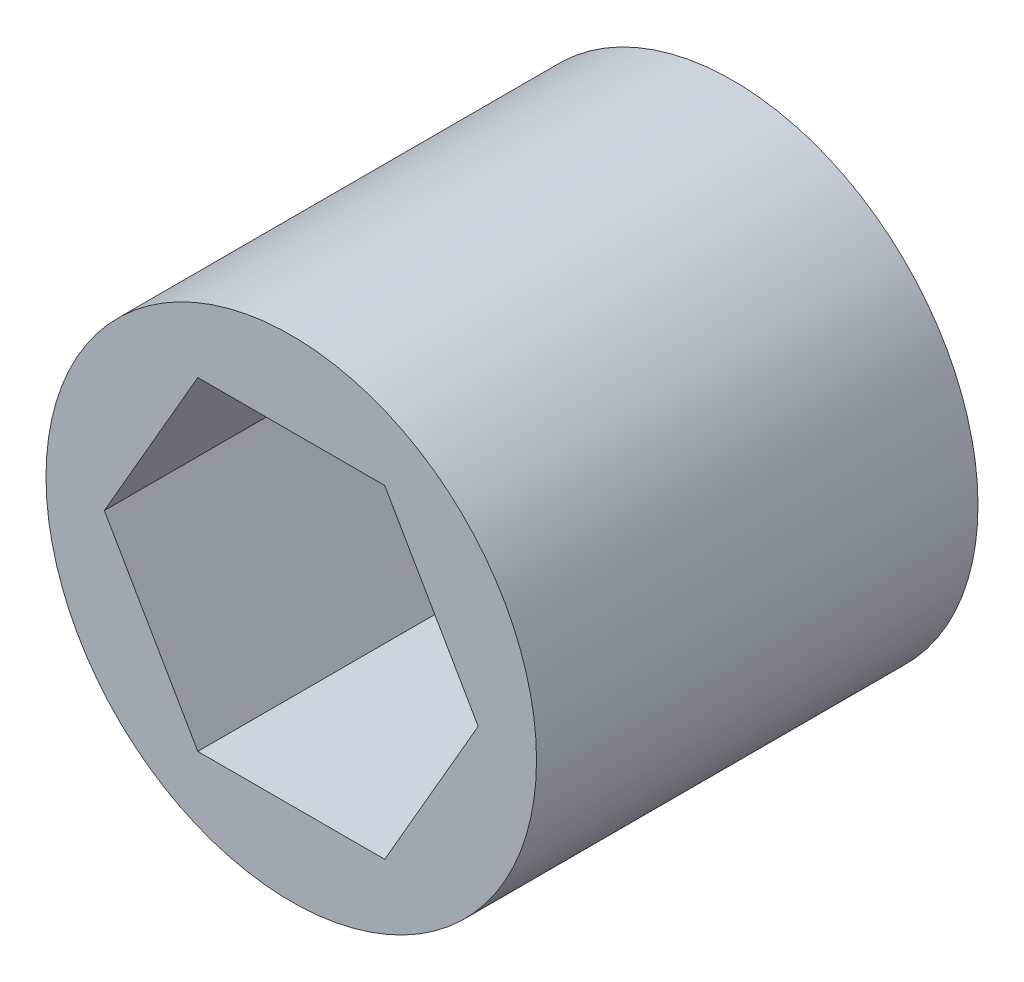
ISO-10303-21;
HEADER;
FILE_DESCRIPTION(('STEP AP214'),'2;1');
FILE_NAME('part.step','',(''),(''),'','','');
FILE_SCHEMA(('AUTOMOTIVE_DESIGN { 1 0 10303 214 1 1 1 1 }'));
ENDSEC;
DATA;
#1=APPLICATION_CONTEXT('core data for automotive mechanical design processes');
#2=APPLICATION_PROTOCOL_DEFINITION('international standard','automotive_design',2000,#1);
#3=PRODUCT_CONTEXT('',#1,'mechanical');
#4=PRODUCT('Part','Part','',(#3));
#5=PRODUCT_RELATED_PRODUCT_CATEGORY('part','',(#4));
#6=PRODUCT_DEFINITION_FORMATION('','',#4);
#7=PRODUCT_DEFINITION_CONTEXT('part definition',#1,'design');
#8=PRODUCT_DEFINITION('design','',#6,#7);
#9=PRODUCT_DEFINITION_SHAPE('','',#8);
#10=(LENGTH_UNIT() NAMED_UNIT(*) SI_UNIT(.MILLI.,.METRE.));
#11=(NAMED_UNIT(*) PLANE_ANGLE_UNIT() SI_UNIT($,.RADIAN.));
#12=(NAMED_UNIT(*) SI_UNIT($,.STERADIAN.) SOLID_ANGLE_UNIT());
#13=UNCERTAINTY_MEASURE_WITH_UNIT(LENGTH_MEASURE(1.E-05),#10,'distance_accuracy_value','');
#14=(GEOMETRIC_REPRESENTATION_CONTEXT(3) GLOBAL_UNCERTAINTY_ASSIGNED_CONTEXT((#13)) GLOBAL_UNIT_ASSIGNED_CONTEXT((#10,
#11,#12)) REPRESENTATION_CONTEXT('',''));
#15=CARTESIAN_POINT('',(0.,0.,0.));
#16=DIRECTION('',(0.,0.,1.));
#17=DIRECTION('',(1.,0.,0.));
#18=AXIS2_PLACEMENT_3D('',#15,#16,#17);
#19=CARTESIAN_POINT('',(0.,0.,18.));
#20=DIRECTION('',(0.,0.,1.));
#21=DIRECTION('',(1.,0.,0.));
#22=AXIS2_PLACEMENT_3D('',#19,#20,#21);
#23=PLANE('',#22);
#24=CARTESIAN_POINT('',(0.,0.,18.));
#25=DIRECTION('',(0.,0.,1.));
#26=DIRECTION('',(1.,0.,0.));
#27=AXIS2_PLACEMENT_3D('',#24,#25,#26);
#28=CIRCLE('',#27,10.);
#29=CARTESIAN_POINT('',(10.,0.,18.));
#30=VERTEX_POINT('',#29);
#31=EDGE_CURVE('E11',#30,#30,#28,.T.);
#32=ORIENTED_EDGE('',*,*,#31,.T.);
#33=EDGE_LOOP('',(#32));
#34=FACE_BOUND('',#33,.T.);
#35=DIRECTION('',(0.5,-0.866025403784439,0.));
#36=VECTOR('',#35,1.);
#37=CARTESIAN_POINT('',(-7.62102355330306,0.,18.));
#38=LINE('',#37,#36);
#39=CARTESIAN_POINT('',(-7.62102355330306,0.,18.));
#40=VERTEX_POINT('',#39);
#41=CARTESIAN_POINT('',(-3.81051177665153,-6.6,18.));
#42=VERTEX_POINT('',#41);
#43=EDGE_CURVE('E94',#40,#42,#38,.T.);
#44=ORIENTED_EDGE('',*,*,#43,.F.);
#45=DIRECTION('',(-0.5,-0.866025403784439,0.));
#46=VECTOR('',#45,1.);
#47=CARTESIAN_POINT('',(-3.81051177665153,6.6,18.));
#48=LINE('',#47,#46);
#49=CARTESIAN_POINT('',(-3.81051177665153,6.6,18.));
#50=VERTEX_POINT('',#49);
#51=EDGE_CURVE('E86',#50,#40,#48,.T.);
#52=ORIENTED_EDGE('',*,*,#51,.F.);
#53=DIRECTION('',(-1.,0.,0.));
#54=VECTOR('',#53,1.);
#55=CARTESIAN_POINT('',(3.81051177665153,6.6,18.));
#56=LINE('',#55,#54);
#57=CARTESIAN_POINT('',(3.81051177665153,6.6,18.));
#58=VERTEX_POINT('',#57);
#59=EDGE_CURVE('E114',#58,#50,#56,.T.);
#60=ORIENTED_EDGE('',*,*,#59,.F.);
#61=DIRECTION('',(-0.5,0.866025403784438,0.));
#62=VECTOR('',#61,1.);
#63=CARTESIAN_POINT('',(7.62102355330306,0.,18.));
#64=LINE('',#63,#62);
#65=CARTESIAN_POINT('',(7.62102355330306,0.,18.));
#66=VERTEX_POINT('',#65);
#67=EDGE_CURVE('E112',#66,#58,#64,.T.);
#68=ORIENTED_EDGE('',*,*,#67,.F.);
#69=DIRECTION('',(0.5,0.866025403784439,0.));
#70=VECTOR('',#69,1.);
#71=CARTESIAN_POINT('',(3.81051177665153,-6.6,18.));
#72=LINE('',#71,#70);
#73=CARTESIAN_POINT('',(3.81051177665153,-6.6,18.));
#74=VERTEX_POINT('',#73);
#75=EDGE_CURVE('E108',#74,#66,#72,.T.);
#76=ORIENTED_EDGE('',*,*,#75,.F.);
#77=DIRECTION('',(1.,0.,0.));
#78=VECTOR('',#77,1.);
#79=CARTESIAN_POINT('',(-3.81051177665153,-6.6,18.));
#80=LINE('',#79,#78);
#81=EDGE_CURVE('E106',#42,#74,#80,.T.);
#82=ORIENTED_EDGE('',*,*,#81,.F.);
#83=EDGE_LOOP('',(#44,#52,#60,#68,#76,#82));
#84=FACE_BOUND('',#83,.T.);
#85=ADVANCED_FACE('F33',(#34,#84),#23,.T.);
#86=CARTESIAN_POINT('',(0.,0.,0.));
#87=DIRECTION('',(0.,0.,1.));
#88=DIRECTION('',(1.,0.,0.));
#89=AXIS2_PLACEMENT_3D('',#86,#87,#88);
#90=PLANE('',#89);
#91=CARTESIAN_POINT('',(0.,0.,0.));
#92=DIRECTION('',(0.,0.,1.));
#93=DIRECTION('',(1.,0.,0.));
#94=AXIS2_PLACEMENT_3D('',#91,#92,#93);
#95=CIRCLE('',#94,10.);
#96=CARTESIAN_POINT('',(10.,0.,0.));
#97=VERTEX_POINT('',#96);
#98=EDGE_CURVE('E37',#97,#97,#95,.T.);
#99=ORIENTED_EDGE('',*,*,#98,.F.);
#100=EDGE_LOOP('',(#99));
#101=FACE_BOUND('',#100,.T.);
#102=DIRECTION('',(-0.5,-0.866025403784439,0.));
#103=VECTOR('',#102,1.);
#104=CARTESIAN_POINT('',(-3.81051177665153,6.6,0.));
#105=LINE('',#104,#103);
#106=CARTESIAN_POINT('',(-3.81051177665153,6.6,0.));
#107=VERTEX_POINT('',#106);
#108=CARTESIAN_POINT('',(-7.62102355330306,0.,0.));
#109=VERTEX_POINT('',#108);
#110=EDGE_CURVE('E56',#107,#109,#105,.T.);
#111=ORIENTED_EDGE('',*,*,#110,.T.);
#112=DIRECTION('',(0.5,-0.866025403784439,0.));
#113=VECTOR('',#112,1.);
#114=CARTESIAN_POINT('',(-7.62102355330306,0.,0.));
#115=LINE('',#114,#113);
#116=CARTESIAN_POINT('',(-3.81051177665153,-6.6,0.));
#117=VERTEX_POINT('',#116);
#118=EDGE_CURVE('E101',#109,#117,#115,.T.);
#119=ORIENTED_EDGE('',*,*,#118,.T.);
#120=DIRECTION('',(1.,0.,0.));
#121=VECTOR('',#120,1.);
#122=CARTESIAN_POINT('',(-3.81051177665153,-6.6,0.));
#123=LINE('',#122,#121);
#124=CARTESIAN_POINT('',(3.81051177665153,-6.6,0.));
#125=VERTEX_POINT('',#124);
#126=EDGE_CURVE('E118',#117,#125,#123,.T.);
#127=ORIENTED_EDGE('',*,*,#126,.T.);
#128=DIRECTION('',(0.5,0.866025403784439,0.));
#129=VECTOR('',#128,1.);
#130=CARTESIAN_POINT('',(3.81051177665153,-6.6,0.));
#131=LINE('',#130,#129);
#132=CARTESIAN_POINT('',(7.62102355330306,0.,0.));
#133=VERTEX_POINT('',#132);
#134=EDGE_CURVE('E121',#125,#133,#131,.T.);
#135=ORIENTED_EDGE('',*,*,#134,.T.);
#136=DIRECTION('',(-0.5,0.866025403784438,0.));
#137=VECTOR('',#136,1.);
#138=CARTESIAN_POINT('',(7.62102355330306,0.,0.));
#139=LINE('',#138,#137);
#140=CARTESIAN_POINT('',(3.81051177665153,6.6,0.));
#141=VERTEX_POINT('',#140);
#142=EDGE_CURVE('E124',#133,#141,#139,.T.);
#143=ORIENTED_EDGE('',*,*,#142,.T.);
#144=DIRECTION('',(-1.,0.,0.));
#145=VECTOR('',#144,1.);
#146=CARTESIAN_POINT('',(3.81051177665153,6.6,0.));
#147=LINE('',#146,#145);
#148=EDGE_CURVE('E95',#141,#107,#147,.T.);
#149=ORIENTED_EDGE('',*,*,#148,.T.);
#150=EDGE_LOOP('',(#111,#119,#127,#135,#143,#149));
#151=FACE_BOUND('',#150,.T.);
#152=ADVANCED_FACE('F141',(#101,#151),#90,.F.);
#153=CARTESIAN_POINT('',(0.,0.,18.));
#154=DIRECTION('',(0.,0.,-1.));
#155=DIRECTION('',(-1.,0.,0.));
#156=AXIS2_PLACEMENT_3D('',#153,#154,#155);
#157=CYLINDRICAL_SURFACE('',#156,10.);
#158=ORIENTED_EDGE('',*,*,#31,.F.);
#159=EDGE_LOOP('',(#158));
#160=FACE_BOUND('',#159,.T.);
#161=ORIENTED_EDGE('',*,*,#98,.T.);
#162=EDGE_LOOP('',(#161));
#163=FACE_BOUND('',#162,.T.);
#164=ADVANCED_FACE('F35',(#160,#163),#157,.T.);
#165=CARTESIAN_POINT('',(-3.81051177665153,6.6,18.));
#166=DIRECTION('',(0.866025403784439,-0.5,0.));
#167=DIRECTION('',(0.5,0.866025403784439,0.));
#168=AXIS2_PLACEMENT_3D('',#165,#166,#167);
#169=PLANE('',#168);
#170=ORIENTED_EDGE('',*,*,#110,.F.);
#171=DIRECTION('',(0.,0.,-1.));
#172=VECTOR('',#171,1.);
#173=CARTESIAN_POINT('',(-3.81051177665153,6.6,18.));
#174=LINE('',#173,#172);
#175=EDGE_CURVE('E90',#50,#107,#174,.T.);
#176=ORIENTED_EDGE('',*,*,#175,.F.);
#177=ORIENTED_EDGE('',*,*,#51,.T.);
#178=DIRECTION('',(0.,0.,-1.));
#179=VECTOR('',#178,1.);
#180=CARTESIAN_POINT('',(-7.62102355330306,0.,18.));
#181=LINE('',#180,#179);
#182=EDGE_CURVE('E89',#40,#109,#181,.T.);
#183=ORIENTED_EDGE('',*,*,#182,.T.);
#184=EDGE_LOOP('',(#170,#176,#177,#183));
#185=FACE_BOUND('',#184,.T.);
#186=ADVANCED_FACE('F88',(#185),#169,.T.);
#187=CARTESIAN_POINT('',(-7.62102355330306,0.,18.));
#188=DIRECTION('',(0.866025403784439,0.5,0.));
#189=DIRECTION('',(-0.5,0.866025403784439,0.));
#190=AXIS2_PLACEMENT_3D('',#187,#188,#189);
#191=PLANE('',#190);
#192=ORIENTED_EDGE('',*,*,#118,.F.);
#193=ORIENTED_EDGE('',*,*,#182,.F.);
#194=ORIENTED_EDGE('',*,*,#43,.T.);
#195=DIRECTION('',(0.,0.,-1.));
#196=VECTOR('',#195,1.);
#197=CARTESIAN_POINT('',(-3.81051177665153,-6.6,18.));
#198=LINE('',#197,#196);
#199=EDGE_CURVE('E102',#42,#117,#198,.T.);
#200=ORIENTED_EDGE('',*,*,#199,.T.);
#201=EDGE_LOOP('',(#192,#193,#194,#200));
#202=FACE_BOUND('',#201,.T.);
#203=ADVANCED_FACE('F98',(#202),#191,.T.);
#204=CARTESIAN_POINT('',(-3.81051177665153,-6.6,18.));
#205=DIRECTION('',(0.,1.,0.));
#206=DIRECTION('',(-1.,0.,0.));
#207=AXIS2_PLACEMENT_3D('',#204,#205,#206);
#208=PLANE('',#207);
#209=ORIENTED_EDGE('',*,*,#126,.F.);
#210=ORIENTED_EDGE('',*,*,#199,.F.);
#211=ORIENTED_EDGE('',*,*,#81,.T.);
#212=DIRECTION('',(0.,0.,-1.));
#213=VECTOR('',#212,1.);
#214=CARTESIAN_POINT('',(3.81051177665153,-6.6,18.));
#215=LINE('',#214,#213);
#216=EDGE_CURVE('E133',#74,#125,#215,.T.);
#217=ORIENTED_EDGE('',*,*,#216,.T.);
#218=EDGE_LOOP('',(#209,#210,#211,#217));
#219=FACE_BOUND('',#218,.T.);
#220=ADVANCED_FACE('F137',(#219),#208,.T.);
#221=CARTESIAN_POINT('',(3.81051177665153,-6.6,18.));
#222=DIRECTION('',(-0.866025403784439,0.5,0.));
#223=DIRECTION('',(-0.5,-0.866025403784439,0.));
#224=AXIS2_PLACEMENT_3D('',#221,#222,#223);
#225=PLANE('',#224);
#226=ORIENTED_EDGE('',*,*,#134,.F.);
#227=ORIENTED_EDGE('',*,*,#216,.F.);
#228=ORIENTED_EDGE('',*,*,#75,.T.);
#229=DIRECTION('',(0.,0.,-1.));
#230=VECTOR('',#229,1.);
#231=CARTESIAN_POINT('',(7.62102355330306,0.,18.));
#232=LINE('',#231,#230);
#233=EDGE_CURVE('E131',#66,#133,#232,.T.);
#234=ORIENTED_EDGE('',*,*,#233,.T.);
#235=EDGE_LOOP('',(#226,#227,#228,#234));
#236=FACE_BOUND('',#235,.T.);
#237=ADVANCED_FACE('F149',(#236),#225,.T.);
#238=CARTESIAN_POINT('',(7.62102355330306,0.,18.));
#239=DIRECTION('',(-0.866025403784439,-0.5,0.));
#240=DIRECTION('',(0.5,-0.866025403784439,0.));
#241=AXIS2_PLACEMENT_3D('',#238,#239,#240);
#242=PLANE('',#241);
#243=ORIENTED_EDGE('',*,*,#142,.F.);
#244=ORIENTED_EDGE('',*,*,#233,.F.);
#245=ORIENTED_EDGE('',*,*,#67,.T.);
#246=DIRECTION('',(0.,0.,-1.));
#247=VECTOR('',#246,1.);
#248=CARTESIAN_POINT('',(3.81051177665153,6.6,18.));
#249=LINE('',#248,#247);
#250=EDGE_CURVE('E48',#58,#141,#249,.T.);
#251=ORIENTED_EDGE('',*,*,#250,.T.);
#252=EDGE_LOOP('',(#243,#244,#245,#251));
#253=FACE_BOUND('',#252,.T.);
#254=ADVANCED_FACE('F147',(#253),#242,.T.);
#255=CARTESIAN_POINT('',(3.81051177665153,6.6,18.));
#256=DIRECTION('',(0.,-1.,0.));
#257=DIRECTION('',(0.,0.,-1.));
#258=AXIS2_PLACEMENT_3D('',#255,#256,#257);
#259=PLANE('',#258);
#260=ORIENTED_EDGE('',*,*,#148,.F.);
#261=ORIENTED_EDGE('',*,*,#250,.F.);
#262=ORIENTED_EDGE('',*,*,#59,.T.);
#263=ORIENTED_EDGE('',*,*,#175,.T.);
#264=EDGE_LOOP('',(#260,#261,#262,#263));
#265=FACE_BOUND('',#264,.T.);
#266=ADVANCED_FACE('F143',(#265),#259,.T.);
#267=CLOSED_SHELL('',(#85,#152,#164,#186,#203,#220,#237,#254,#266));
#268=MANIFOLD_SOLID_BREP('B2',#267);
#269=ADVANCED_BREP_SHAPE_REPRESENTATION('',(#18,#268),#14);
#270=SHAPE_DEFINITION_REPRESENTATION(#9,#269);
ENDSEC;
END-ISO-10303-21;
